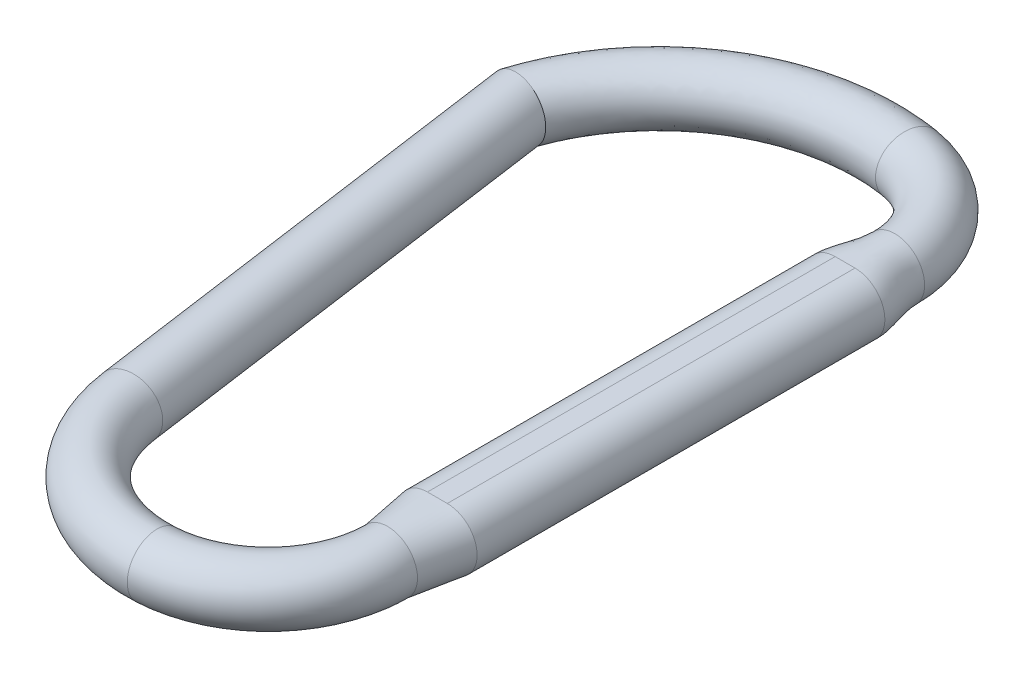
ISO-10303-21;
HEADER;
FILE_DESCRIPTION(('STEP AP214'),'2;1');
FILE_NAME('part.step','',(''),(''),'','','');
FILE_SCHEMA(('AUTOMOTIVE_DESIGN { 1 0 10303 214 1 1 1 1 }'));
ENDSEC;
DATA;
#1=APPLICATION_CONTEXT('core data for automotive mechanical design processes');
#2=APPLICATION_PROTOCOL_DEFINITION('international standard','automotive_design',2000,#1);
#3=PRODUCT_CONTEXT('',#1,'mechanical');
#4=PRODUCT('Part','Part','',(#3));
#5=PRODUCT_RELATED_PRODUCT_CATEGORY('part','',(#4));
#6=PRODUCT_DEFINITION_FORMATION('','',#4);
#7=PRODUCT_DEFINITION_CONTEXT('part definition',#1,'design');
#8=PRODUCT_DEFINITION('design','',#6,#7);
#9=PRODUCT_DEFINITION_SHAPE('','',#8);
#10=(LENGTH_UNIT() NAMED_UNIT(*) SI_UNIT(.MILLI.,.METRE.));
#11=(NAMED_UNIT(*) PLANE_ANGLE_UNIT() SI_UNIT($,.RADIAN.));
#12=(NAMED_UNIT(*) SI_UNIT($,.STERADIAN.) SOLID_ANGLE_UNIT());
#13=UNCERTAINTY_MEASURE_WITH_UNIT(LENGTH_MEASURE(1.E-05),#10,'distance_accuracy_value','');
#14=(GEOMETRIC_REPRESENTATION_CONTEXT(3) GLOBAL_UNCERTAINTY_ASSIGNED_CONTEXT((#13)) GLOBAL_UNIT_ASSIGNED_CONTEXT((#10,
#11,#12)) REPRESENTATION_CONTEXT('',''));
#15=CARTESIAN_POINT('',(0.,0.,0.));
#16=DIRECTION('',(0.,0.,1.));
#17=DIRECTION('',(1.,0.,0.));
#18=AXIS2_PLACEMENT_3D('',#15,#16,#17);
#19=CARTESIAN_POINT('',(-21.010039592114,0.,-46.87299947285));
#20=DIRECTION('',(0.13917310096006,0.,0.990268068741571));
#21=DIRECTION('',(0.990268068741571,0.,-0.13917310096006));
#22=AXIS2_PLACEMENT_3D('',#19,#20,#21);
#23=CYLINDRICAL_SURFACE('',#22,3.);
#24=CARTESIAN_POINT('',(-20.8896587934592,-3.,-46.0164455829451));
#25=CARTESIAN_POINT('',(-20.8951421724253,-3.00000001724637,-46.016930285687));
#26=CARTESIAN_POINT('',(-20.9006257203816,-2.99998563688095,-46.0174150031077));
#27=CARTESIAN_POINT('',(-20.9938981031441,-2.99949619718511,-46.025659797391));
#28=CARTESIAN_POINT('',(-21.0817077632023,-2.99534626632621,-46.0334216495132));
#29=CARTESIAN_POINT('',(-21.2566964226179,-2.9796888896988,-46.0488894914073));
#30=CARTESIAN_POINT('',(-21.3438750752085,-2.96817766929926,-46.0565954504677));
#31=CARTESIAN_POINT('',(-21.5171642397895,-2.93782561411557,-46.0719128522698));
#32=CARTESIAN_POINT('',(-21.6032720259248,-2.91896894098434,-46.079524053848));
#33=CARTESIAN_POINT('',(-21.7736483920337,-2.87403559519605,-46.0945838006386));
#34=CARTESIAN_POINT('',(-21.8579154186672,-2.84795306096237,-46.1020322084787));
#35=CARTESIAN_POINT('',(-22.1067312899974,-2.75917076926257,-46.1240250692375));
#36=CARTESIAN_POINT('',(-22.2676635406951,-2.68587157970876,-46.1382497418877));
#37=CARTESIAN_POINT('',(-22.5747456344284,-2.51281838387039,-46.1653923057207));
#38=CARTESIAN_POINT('',(-22.7208970469696,-2.41306719047859,-46.1783103356496));
#39=CARTESIAN_POINT('',(-22.9247206794201,-2.2464254273398,-46.1963258322359));
#40=CARTESIAN_POINT('',(-22.9897656410219,-2.18842172643041,-46.2020749936319));
#41=CARTESIAN_POINT('',(-23.1146072937272,-2.06706138885659,-46.2131094210775));
#42=CARTESIAN_POINT('',(-23.1744089255577,-2.00370990429972,-46.2183951238389));
#43=CARTESIAN_POINT('',(-23.2883520090666,-1.87202252243064,-46.228466234393));
#44=CARTESIAN_POINT('',(-23.3424912095336,-1.80368466087779,-46.2332514432046));
#45=CARTESIAN_POINT('',(-23.444640825475,-1.66254349678639,-46.242280152541));
#46=CARTESIAN_POINT('',(-23.4926499790285,-1.5897392793636,-46.2465235415278));
#47=CARTESIAN_POINT('',(-23.6245654839256,-1.36919677615312,-46.2581831690165));
#48=CARTESIAN_POINT('',(-23.6993805224947,-1.21582278118065,-46.2647958538162));
#49=CARTESIAN_POINT('',(-23.8215600497354,-0.898527407613988,-46.2755949560412));
#50=CARTESIAN_POINT('',(-23.8689291290896,-0.73460779800565,-46.2797817792223));
#51=CARTESIAN_POINT('',(-23.9339250396025,-0.404813782767175,-46.2855265919895));
#52=CARTESIAN_POINT('',(-23.9522077715259,-0.23906998094187,-46.287142554796));
#53=CARTESIAN_POINT('',(-23.9604729526079,0.0931160017219928,-46.2878730923304));
#54=CARTESIAN_POINT('',(-23.950457573906,0.259558127978508,-46.286987859048));
#55=CARTESIAN_POINT('',(-23.9027191387679,0.586626155300826,-46.2827683865265));
#56=CARTESIAN_POINT('',(-23.86528224346,0.747294280777364,-46.2794594402881));
#57=CARTESIAN_POINT('',(-23.764239320106,1.06010106739429,-46.2705285382299));
#58=CARTESIAN_POINT('',(-23.7006330009043,1.21223963361514,-46.2649065566757));
#59=CARTESIAN_POINT('',(-23.5487534644931,1.50481263920863,-46.2514823647213));
#60=CARTESIAN_POINT('',(-23.4603215948277,1.64516399679962,-46.2436661315348));
#61=CARTESIAN_POINT('',(-23.2616825698692,1.90934717733818,-46.2261089995393));
#62=CARTESIAN_POINT('',(-23.1514738150893,2.03317778573619,-46.2163679593554));
#63=CARTESIAN_POINT('',(-22.9069029753268,2.26655507987003,-46.1947509757078));
#64=CARTESIAN_POINT('',(-22.7716536430332,2.37516531676004,-46.1827966082223));
#65=CARTESIAN_POINT('',(-22.4848575764178,2.56811954472958,-46.1574472421762));
#66=CARTESIAN_POINT('',(-22.3333009081481,2.65244862816305,-46.1440513654903));
#67=CARTESIAN_POINT('',(-22.0183464771175,2.79470619940215,-46.1162127555998));
#68=CARTESIAN_POINT('',(-21.8549459739908,2.8526285546105,-46.1017697801227));
#69=CARTESIAN_POINT('',(-21.5211522594202,2.94059280071035,-46.0722654006039));
#70=CARTESIAN_POINT('',(-21.3507737453045,2.97069043164866,-46.0572052963479));
#71=CARTESIAN_POINT('',(-21.0884055316866,2.99502937517665,-46.0340136924453));
#72=CARTESIAN_POINT('',(-20.997256631083,2.99947891711674,-46.0259566739203));
#73=CARTESIAN_POINT('',(-20.9006258013465,2.99998561578759,-46.0174150102755));
#74=CARTESIAN_POINT('',(-20.8951422586448,2.99999999484322,-46.0169302933139));
#75=CARTESIAN_POINT('',(-20.8896587934592,3.,-46.0164455829451));
#76=B_SPLINE_CURVE_WITH_KNOTS('',3,(#24,#25,#26,#27,#28,#29,#30,#31,#32,#33,#34,#35,#36,#37,#38,
#39,#40,#41,#42,#43,#44,#45,#46,#47,#48,#49,#50,#51,#52,#53,#54,#55,#56,#57,#58,#59,#60,#61,#62,
#63,#64,#65,#66,#67,#68,#69,#70,#71,#72,#73,#74,#75),.UNSPECIFIED.,.F.,.F.,(4,2,2,2,2,2,2,2,2,2,
2,2,2,2,2,2,2,2,2,2,2,2,2,2,2,4),(0.,0.0165147571824949,0.28090350468109,0.545427930996735,
0.810525913435018,1.0758395746906,1.6053542719485,2.1348126834448,2.39656394511468,
2.65806584980441,2.91967132767677,3.18133057266935,3.69092805578215,4.2004402776712,
4.69829124615587,5.19610400105184,5.68879446502532,6.18149041072077,6.6774096522034,
7.17336533192341,7.69246926105735,8.21189122271954,8.73143375157408,9.24993323406481,
9.52444073575411,9.54095549293659),.UNSPECIFIED.);
#77=CARTESIAN_POINT('',(-20.8896587934592,-3.,-46.0164455829451));
#78=VERTEX_POINT('',#77);
#79=CARTESIAN_POINT('',(-20.8896587934592,3.,-46.0164455829451));
#80=VERTEX_POINT('',#79);
#81=EDGE_CURVE('E314',#78,#80,#76,.T.);
#82=ORIENTED_EDGE('',*,*,#81,.F.);
#83=CARTESIAN_POINT('',(-20.8896587934592,-3.,-46.0164455829451));
#84=CARTESIAN_POINT('',(-20.8841754144568,-3.00000001726389,-46.0159608806029));
#85=CARTESIAN_POINT('',(-20.8786918870788,-2.99998563690161,-46.0154759307387));
#86=CARTESIAN_POINT('',(-20.7852165904912,-2.99949514284939,-46.0072052123919));
#87=CARTESIAN_POINT('',(-20.6972091543279,-2.99532723552518,-45.999358026544));
#88=CARTESIAN_POINT('',(-20.5218388202666,-2.97960711417015,-45.9836029130286));
#89=CARTESIAN_POINT('',(-20.4344762792888,-2.96805108185668,-45.9756949560429));
#90=CARTESIAN_POINT('',(-20.2608332379902,-2.93758913412737,-45.9598607263474));
#91=CARTESIAN_POINT('',(-20.1745555161273,-2.918667228798,-45.9519344513401));
#92=CARTESIAN_POINT('',(-20.0038549280286,-2.87358927225436,-45.9361383356767));
#93=CARTESIAN_POINT('',(-19.9194336208397,-2.84742737377111,-45.9282685459332));
#94=CARTESIAN_POINT('',(-19.6701937823624,-2.7584001620235,-45.9048669109586));
#95=CARTESIAN_POINT('',(-19.5090120188892,-2.68492514613336,-45.8895074304168));
#96=CARTESIAN_POINT('',(-19.2014624905548,-2.51151000997371,-45.8598011399984));
#97=CARTESIAN_POINT('',(-19.05509324771,-2.4115725337172,-45.8454542291314));
#98=CARTESIAN_POINT('',(-18.8508519581832,-2.24454824457002,-45.8251885801709));
#99=CARTESIAN_POINT('',(-18.7856079381955,-2.18634841088113,-45.8186715463453));
#100=CARTESIAN_POINT('',(-18.660391023001,-2.06457020204743,-45.8060912871512));
#101=CARTESIAN_POINT('',(-18.6004131681056,-2.00099700077651,-45.8000276356028));
#102=CARTESIAN_POINT('',(-18.4861453305037,-1.86883876362132,-45.7884138206629));
#103=CARTESIAN_POINT('',(-18.4318575895841,-1.80025177033644,-45.7828638597547));
#104=CARTESIAN_POINT('',(-18.3294456912057,-1.65858405899606,-45.772344346583));
#105=CARTESIAN_POINT('',(-18.281322792024,-1.58550242805197,-45.7673749128263));
#106=CARTESIAN_POINT('',(-18.1492590452969,-1.36430645569479,-45.7536816479021));
#107=CARTESIAN_POINT('',(-18.0744341895986,-1.21053734066333,-45.7458466150474));
#108=CARTESIAN_POINT('',(-17.9523935953468,-0.892399581644719,-45.7330080848875));
#109=CARTESIAN_POINT('',(-17.9051724169469,-0.72803303318346,-45.7280040296889));
#110=CARTESIAN_POINT('',(-17.8408048652615,-0.398028715403323,-45.7211710336458));
#111=CARTESIAN_POINT('',(-17.822883547413,-0.232544116681888,-45.7192602924425));
#112=CARTESIAN_POINT('',(-17.8153214622296,0.0990697030326118,-45.7184548434859));
#113=CARTESIAN_POINT('',(-17.82567800624,0.265198861241316,-45.7195598489958));
#114=CARTESIAN_POINT('',(-17.8739771570599,0.591161460422553,-45.7246943629733));
#115=CARTESIAN_POINT('',(-17.9115686653581,0.751047993650433,-45.7286866490242));
#116=CARTESIAN_POINT('',(-18.0127556319482,1.06235574995448,-45.7393666964543));
#117=CARTESIAN_POINT('',(-18.0763519673559,1.21377668729906,-45.7460545487522));
#118=CARTESIAN_POINT('',(-18.1899123485645,1.43192600516249,-45.75789431535));
#119=CARTESIAN_POINT('',(-18.2310235120433,1.50345125061217,-45.7621659544882));
#120=CARTESIAN_POINT('',(-18.3189931109808,1.64284156808303,-45.7712644762543));
#121=CARTESIAN_POINT('',(-18.3658503716853,1.71070738418097,-45.7760912453769));
#122=CARTESIAN_POINT('',(-18.4649426073333,1.84231372795867,-45.7862466985763));
#123=CARTESIAN_POINT('',(-18.5171757684058,1.90605563533231,-45.7915752133091));
#124=CARTESIAN_POINT('',(-18.6266758244383,2.02908952130601,-45.8026839570851));
#125=CARTESIAN_POINT('',(-18.6839470667635,2.08837757325301,-45.8084645757627));
#126=CARTESIAN_POINT('',(-18.8654838166437,2.26162084209706,-45.826678663273));
#127=CARTESIAN_POINT('',(-18.9971705592696,2.36789859643496,-45.8397470274584));
#128=CARTESIAN_POINT('',(-19.2760879381005,2.55741589632404,-45.8670491001033));
#129=CARTESIAN_POINT('',(-19.4233215998858,2.64065094608572,-45.8812830352726));
#130=CARTESIAN_POINT('',(-19.6548629552924,2.74778335144924,-45.9033554048232));
#131=CARTESIAN_POINT('',(-19.735056226172,2.78088039577154,-45.9109474352307));
#132=CARTESIAN_POINT('',(-19.8978550590291,2.8402592868587,-45.9262499892075));
#133=CARTESIAN_POINT('',(-19.9804584207828,2.8665471458607,-45.9339604018331));
#134=CARTESIAN_POINT('',(-20.1474349423873,2.91214117251307,-45.9494342800216));
#135=CARTESIAN_POINT('',(-20.2318054247945,2.9314571934694,-45.9571976547855));
#136=CARTESIAN_POINT('',(-20.4018419871953,2.96304638286254,-45.9727302229829));
#137=CARTESIAN_POINT('',(-20.487508029451,2.97531975603819,-45.9804994162408));
#138=CARTESIAN_POINT('',(-20.6731099932719,2.99411498837592,-45.9972080574238));
#139=CARTESIAN_POINT('',(-20.7731753829563,2.9994318502992,-46.0061398007653));
#140=CARTESIAN_POINT('',(-20.8786919243768,2.99998564304928,-46.0154759341691));
#141=CARTESIAN_POINT('',(-20.8841754525497,3.00000002361417,-46.0159608841108));
#142=CARTESIAN_POINT('',(-20.8896587934592,3.,-46.0164455829451));
#143=B_SPLINE_CURVE_WITH_KNOTS('',3,(#83,#84,#85,#86,#87,#88,#89,#90,#91,#92,#93,#94,#95,#96,
#97,#98,#99,#100,#101,#102,#103,#104,#105,#106,#107,#108,#109,#110,#111,#112,#113,#114,#115,
#116,#117,#118,#119,#120,#121,#122,#123,#124,#125,#126,#127,#128,#129,#130,#131,#132,#133,#134,
#135,#136,#137,#138,#139,#140,#141,#142),.UNSPECIFIED.,.F.,.F.,(4,2,2,2,2,2,2,2,2,2,2,2,2,2,2,2,
2,2,2,2,2,2,2,2,2,2,2,2,2,4),(0.,0.0165147571950974,0.281516718087598,0.546655746401362,
0.81237358007404,1.07830664613123,1.60900330966092,2.13964696830225,2.40239346052579,
2.66488978191802,2.92748913572783,3.19014200235839,3.70094942104827,4.21165614114543,
4.70862295814746,5.20554252526409,5.69616753876884,6.18680910190998,6.43440241349732,
6.68194519027568,6.92940471630417,7.17707991022057,7.68379232741825,8.19060353811543,
8.45160827165583,8.71238175681237,8.97278523391203,9.23318114036325,9.53444519200026,
9.55095994919536),.UNSPECIFIED.);
#144=EDGE_CURVE('E317',#78,#80,#143,.T.);
#145=ORIENTED_EDGE('',*,*,#144,.T.);
#146=EDGE_LOOP('',(#82,#145));
#147=FACE_BOUND('',#146,.T.);
#148=CARTESIAN_POINT('',(-14.4897268873601,0.,-0.478563872965583));
#149=DIRECTION('',(0.139173100960063,0.,0.990268068741571));
#150=DIRECTION('',(0.990268068741571,0.,-0.139173100960063));
#151=AXIS2_PLACEMENT_3D('',#148,#149,#150);
#152=CIRCLE('',#151,3.);
#153=CARTESIAN_POINT('',(-17.4605310935849,0.,-0.0610445700853991));
#154=VERTEX_POINT('',#153);
#155=EDGE_CURVE('E307',#154,#154,#152,.T.);
#156=ORIENTED_EDGE('',*,*,#155,.F.);
#157=EDGE_LOOP('',(#156));
#158=FACE_BOUND('',#157,.T.);
#159=ADVANCED_FACE('F296',(#147,#158),#23,.T.);
#160=CARTESIAN_POINT('',(-0.130839890607351,0.,-2.49657383688644));
#161=DIRECTION('',(0.,1.,0.));
#162=DIRECTION('',(0.,0.,1.));
#163=AXIS2_PLACEMENT_3D('',#160,#161,#162);
#164=TOROIDAL_SURFACE('',#163,14.5000000000001,3.);
#165=CARTESIAN_POINT('',(0.628031474915289,0.,11.9835544170549));
#166=DIRECTION('',(0.998629534754574,0.,-0.0523359562429437));
#167=DIRECTION('',(-0.0523359562429437,0.,-0.998629534754574));
#168=AXIS2_PLACEMENT_3D('',#165,#166,#167);
#169=CIRCLE('',#168,3.);
#170=CARTESIAN_POINT('',(0.785039343644113,0.,14.9794430213187));
#171=VERTEX_POINT('',#170);
#172=EDGE_CURVE('E15',#171,#171,#169,.T.);
#173=CARTESIAN_POINT('',(-0.130839890607351,0.,-2.49657383688644));
#174=DIRECTION('',(0.,1.,0.));
#175=DIRECTION('',(0.,0.,1.));
#176=AXIS2_PLACEMENT_3D('',#173,#174,#175);
#177=CIRCLE('',#176,17.5000000000001);
#178=EDGE_CURVE('',#154,#171,#177,.T.);
#179=ORIENTED_EDGE('',*,*,#155,.T.);
#180=ORIENTED_EDGE('',*,*,#172,.F.);
#181=ORIENTED_EDGE('',*,*,#178,.T.);
#182=ORIENTED_EDGE('',*,*,#178,.F.);
#183=EDGE_LOOP('',(#179,#181,#180,#182));
#184=FACE_BOUND('',#183,.T.);
#185=ADVANCED_FACE('F623',(#184),#164,.T.);
#186=CARTESIAN_POINT('',(0.,0.,0.));
#187=DIRECTION('',(0.,1.,0.));
#188=DIRECTION('',(0.,0.,1.));
#189=AXIS2_PLACEMENT_3D('',#186,#187,#188);
#190=TOROIDAL_SURFACE('',#189,12.,3.);
#191=ORIENTED_EDGE('',*,*,#172,.T.);
#192=EDGE_LOOP('',(#191));
#193=FACE_BOUND('',#192,.T.);
#194=CARTESIAN_POINT('',(12.,0.,0.));
#195=DIRECTION('',(0.,0.,1.));
#196=DIRECTION('',(1.,0.,0.));
#197=AXIS2_PLACEMENT_3D('',#194,#195,#196);
#198=CIRCLE('',#197,3.);
#199=CARTESIAN_POINT('',(15.,0.,0.));
#200=VERTEX_POINT('',#199);
#201=EDGE_CURVE('E570',#200,#200,#198,.F.);
#202=ORIENTED_EDGE('',*,*,#201,.F.);
#203=EDGE_LOOP('',(#202));
#204=FACE_BOUND('',#203,.T.);
#205=ADVANCED_FACE('F298',(#193,#204),#190,.T.);
#206=CARTESIAN_POINT('',(3.15418270687267,0.,-57.9206372285439));
#207=CARTESIAN_POINT('',(0.935857684764375,0.,-58.2914775108197));
#208=CARTESIAN_POINT('',(-1.34841307466067,0.,-58.2642441530716));
#209=CARTESIAN_POINT('',(-5.76611963223035,0.,-57.4170009365223));
#210=CARTESIAN_POINT('',(-7.8983918081825,0.,-56.597214214087));
#211=CARTESIAN_POINT('',(-11.7458601181143,0.,-54.2667765083098));
#212=CARTESIAN_POINT('',(-13.4600429064005,0.,-52.7567393086641));
#213=CARTESIAN_POINT('',(-15.5578651785087,0.,-50.1146303562383));
#214=CARTESIAN_POINT('',(-16.1786796426522,0.,-49.1717851595225));
#215=CARTESIAN_POINT('',(-16.9777715733016,0.,-47.6862329237682));
#216=CARTESIAN_POINT('',(-17.2221421093404,0.,-47.1792123400172));
#217=CARTESIAN_POINT('',(-17.5542607274369,0.,-46.4039255360115));
#218=CARTESIAN_POINT('',(-17.6592304308953,0.,-46.1430382759708));
#219=CARTESIAN_POINT('',(-17.8574929369031,0.,-45.616851470807));
#220=CARTESIAN_POINT('',(-17.9438855104909,0.,-45.3726502068817));
#221=CARTESIAN_POINT('',(-18.1216320372242,0.,-44.8289305195341));
#222=CARTESIAN_POINT('',(-18.2173244687306,0.,-44.5361915610607));
#223=CARTESIAN_POINT('',(-18.3069113882336,0.,-44.2621388982983));
#224=CARTESIAN_POINT('',(3.15418270687267,6.,-57.9206372285439));
#225=CARTESIAN_POINT('',(0.935857684764375,6.,-58.2914775108197));
#226=CARTESIAN_POINT('',(-1.34841307466067,6.,-58.2642441530716));
#227=CARTESIAN_POINT('',(-5.76611963223035,6.,-57.4170009365223));
#228=CARTESIAN_POINT('',(-7.8983918081825,6.,-56.597214214087));
#229=CARTESIAN_POINT('',(-11.7458601181143,6.,-54.2667765083098));
#230=CARTESIAN_POINT('',(-13.4600429064005,6.,-52.7567393086641));
#231=CARTESIAN_POINT('',(-15.5578651785087,6.,-50.1146303562383));
#232=CARTESIAN_POINT('',(-16.1786796426522,6.,-49.1717851595225));
#233=CARTESIAN_POINT('',(-16.9777715733016,6.,-47.6862329237682));
#234=CARTESIAN_POINT('',(-17.2221421093404,6.,-47.1792123400172));
#235=CARTESIAN_POINT('',(-17.5542607274369,6.,-46.4039255360115));
#236=CARTESIAN_POINT('',(-17.6592304308953,6.,-46.1430382759708));
#237=CARTESIAN_POINT('',(-17.8574929369031,6.,-45.616851470807));
#238=CARTESIAN_POINT('',(-17.9438855104909,6.,-45.3726502068817));
#239=CARTESIAN_POINT('',(-18.1216320372242,6.,-44.8289305195341));
#240=CARTESIAN_POINT('',(-18.2173244687306,6.,-44.5361915610607));
#241=CARTESIAN_POINT('',(-18.3069113882336,6.,-44.2621388982983));
#242=CARTESIAN_POINT('',(4.14348216990634,6.,-63.8385157819143));
#243=CARTESIAN_POINT('',(1.22463345660595,6.,-64.3264635217509));
#244=CARTESIAN_POINT('',(-1.78098596370917,6.,-64.2906301562933));
#245=CARTESIAN_POINT('',(-7.59375774994703,6.,-63.1758364503064));
#246=CARTESIAN_POINT('',(-10.399379034115,6.,-62.0971697102661));
#247=CARTESIAN_POINT('',(-15.4618373366541,6.,-59.0308043079163));
#248=CARTESIAN_POINT('',(-17.7173410054562,6.,-57.0439132557572));
#249=CARTESIAN_POINT('',(-20.4776334687519,6.,-53.5674541078277));
#250=CARTESIAN_POINT('',(-21.2944946057871,6.,-52.3268683226758));
#251=CARTESIAN_POINT('',(-22.3459313566373,6.,-50.3721943282618));
#252=CARTESIAN_POINT('',(-22.6674715356357,6.,-49.705061981224));
#253=CARTESIAN_POINT('',(-23.1044697173438,6.,-48.6849477654229));
#254=CARTESIAN_POINT('',(-23.2425877482096,6.,-48.3416750548433));
#255=CARTESIAN_POINT('',(-23.5034594666404,6.,-47.6493239954194));
#256=CARTESIAN_POINT('',(-23.6331064283333,6.,-47.2791454768079));
#257=CARTESIAN_POINT('',(-23.8368656113514,6.,-46.6558573747056));
#258=CARTESIAN_POINT('',(-23.9203407962011,6.,-46.4004889538082));
#259=CARTESIAN_POINT('',(-24.0099277157041,6.,-46.1264362910458));
#260=CARTESIAN_POINT('',(4.14348216990634,0.,-63.8385157819143));
#261=CARTESIAN_POINT('',(1.22463345660595,0.,-64.3264635217509));
#262=CARTESIAN_POINT('',(-1.78098596370917,0.,-64.2906301562933));
#263=CARTESIAN_POINT('',(-7.59375774994703,0.,-63.1758364503064));
#264=CARTESIAN_POINT('',(-10.399379034115,0.,-62.0971697102661));
#265=CARTESIAN_POINT('',(-15.4618373366541,0.,-59.0308043079163));
#266=CARTESIAN_POINT('',(-17.7173410054562,0.,-57.0439132557571));
#267=CARTESIAN_POINT('',(-20.4776334687519,0.,-53.5674541078277));
#268=CARTESIAN_POINT('',(-21.2944946057871,0.,-52.3268683226758));
#269=CARTESIAN_POINT('',(-22.3459313566373,0.,-50.3721943282618));
#270=CARTESIAN_POINT('',(-22.6674715356357,0.,-49.705061981224));
#271=CARTESIAN_POINT('',(-23.1044697173438,0.,-48.6849477654229));
#272=CARTESIAN_POINT('',(-23.2425877482096,0.,-48.3416750548433));
#273=CARTESIAN_POINT('',(-23.5034594666404,0.,-47.6493239954194));
#274=CARTESIAN_POINT('',(-23.6331064283333,0.,-47.2791454768079));
#275=CARTESIAN_POINT('',(-23.8368656113514,0.,-46.6558573747056));
#276=CARTESIAN_POINT('',(-23.9203407962011,0.,-46.4004889538082));
#277=CARTESIAN_POINT('',(-24.0099277157041,0.,-46.1264362910458));
#278=CARTESIAN_POINT('',(4.14348216990634,-6.,-63.8385157819143));
#279=CARTESIAN_POINT('',(1.22463345660595,-6.,-64.3264635217509));
#280=CARTESIAN_POINT('',(-1.78098596370917,-6.,-64.2906301562933));
#281=CARTESIAN_POINT('',(-7.59375774994703,-6.,-63.1758364503064));
#282=CARTESIAN_POINT('',(-10.399379034115,-6.,-62.0971697102661));
#283=CARTESIAN_POINT('',(-15.4618373366541,-6.,-59.0308043079163));
#284=CARTESIAN_POINT('',(-17.7173410054562,-6.,-57.0439132557572));
#285=CARTESIAN_POINT('',(-20.4776334687519,-6.,-53.5674541078277));
#286=CARTESIAN_POINT('',(-21.2944946057871,-6.,-52.3268683226758));
#287=CARTESIAN_POINT('',(-22.3459313566373,-6.,-50.3721943282618));
#288=CARTESIAN_POINT('',(-22.6674715356357,-6.,-49.705061981224));
#289=CARTESIAN_POINT('',(-23.1044697173438,-6.,-48.6849477654229));
#290=CARTESIAN_POINT('',(-23.2425877482096,-6.,-48.3416750548433));
#291=CARTESIAN_POINT('',(-23.5034594666404,-6.,-47.6493239954194));
#292=CARTESIAN_POINT('',(-23.6331064283333,-6.,-47.2791454768079));
#293=CARTESIAN_POINT('',(-23.8368656113514,-6.,-46.6558573747056));
#294=CARTESIAN_POINT('',(-23.9203407962011,-6.,-46.4004889538082));
#295=CARTESIAN_POINT('',(-24.0099277157041,-6.,-46.1264362910458));
#296=CARTESIAN_POINT('',(3.15418270687267,-6.,-57.9206372285439));
#297=CARTESIAN_POINT('',(0.935857684764375,-6.,-58.2914775108197));
#298=CARTESIAN_POINT('',(-1.34841307466067,-6.,-58.2642441530716));
#299=CARTESIAN_POINT('',(-5.76611963223035,-6.,-57.4170009365223));
#300=CARTESIAN_POINT('',(-7.8983918081825,-6.,-56.597214214087));
#301=CARTESIAN_POINT('',(-11.7458601181143,-6.,-54.2667765083098));
#302=CARTESIAN_POINT('',(-13.4600429064005,-6.,-52.7567393086641));
#303=CARTESIAN_POINT('',(-15.5578651785087,-6.,-50.1146303562383));
#304=CARTESIAN_POINT('',(-16.1786796426522,-6.,-49.1717851595225));
#305=CARTESIAN_POINT('',(-16.9777715733016,-6.,-47.6862329237682));
#306=CARTESIAN_POINT('',(-17.2221421093404,-6.,-47.1792123400172));
#307=CARTESIAN_POINT('',(-17.5542607274369,-6.,-46.4039255360115));
#308=CARTESIAN_POINT('',(-17.6592304308953,-6.,-46.1430382759708));
#309=CARTESIAN_POINT('',(-17.8574929369031,-6.,-45.616851470807));
#310=CARTESIAN_POINT('',(-17.9438855104909,-6.,-45.3726502068817));
#311=CARTESIAN_POINT('',(-18.1216320372242,-6.,-44.8289305195341));
#312=CARTESIAN_POINT('',(-18.2173244687306,-6.,-44.5361915610607));
#313=CARTESIAN_POINT('',(-18.3069113882336,-6.,-44.2621388982983));
#314=CARTESIAN_POINT('',(3.15418270687267,0.,-57.9206372285439));
#315=CARTESIAN_POINT('',(0.935857684764375,0.,-58.2914775108197));
#316=CARTESIAN_POINT('',(-1.34841307466067,0.,-58.2642441530716));
#317=CARTESIAN_POINT('',(-5.76611963223035,0.,-57.4170009365223));
#318=CARTESIAN_POINT('',(-7.8983918081825,0.,-56.597214214087));
#319=CARTESIAN_POINT('',(-11.7458601181143,0.,-54.2667765083098));
#320=CARTESIAN_POINT('',(-13.4600429064005,0.,-52.7567393086641));
#321=CARTESIAN_POINT('',(-15.5578651785087,0.,-50.1146303562383));
#322=CARTESIAN_POINT('',(-16.1786796426522,0.,-49.1717851595225));
#323=CARTESIAN_POINT('',(-16.9777715733016,0.,-47.6862329237682));
#324=CARTESIAN_POINT('',(-17.2221421093404,0.,-47.1792123400172));
#325=CARTESIAN_POINT('',(-17.5542607274369,0.,-46.4039255360115));
#326=CARTESIAN_POINT('',(-17.6592304308953,0.,-46.1430382759708));
#327=CARTESIAN_POINT('',(-17.8574929369031,0.,-45.616851470807));
#328=CARTESIAN_POINT('',(-17.9438855104909,0.,-45.3726502068817));
#329=CARTESIAN_POINT('',(-18.1216320372242,0.,-44.8289305195341));
#330=CARTESIAN_POINT('',(-18.2173244687306,0.,-44.5361915610607));
#331=CARTESIAN_POINT('',(-18.3069113882336,0.,-44.2621388982983));
#332=(BOUNDED_SURFACE() B_SPLINE_SURFACE(3,3,((#206,#207,#208,#209,#210,#211,#212,#213,#214,
#215,#216,#217,#218,#219,#220,#221,#222,#223),(#224,#225,#226,#227,#228,#229,#230,#231,#232,
#233,#234,#235,#236,#237,#238,#239,#240,#241),(#242,#243,#244,#245,#246,#247,#248,#249,#250,
#251,#252,#253,#254,#255,#256,#257,#258,#259),(#260,#261,#262,#263,#264,#265,#266,#267,#268,
#269,#270,#271,#272,#273,#274,#275,#276,#277),(#278,#279,#280,#281,#282,#283,#284,#285,#286,
#287,#288,#289,#290,#291,#292,#293,#294,#295),(#296,#297,#298,#299,#300,#301,#302,#303,#304,
#305,#306,#307,#308,#309,#310,#311,#312,#313),(#314,#315,#316,#317,#318,#319,#320,#321,#322,
#323,#324,#325,#326,#327,#328,#329,#330,#331)),.UNSPECIFIED.,.T.,.F.,
.F.) B_SPLINE_SURFACE_WITH_KNOTS((4,3,4),(4,2,2,2,2,2,2,2,4),(0.,0.5,1.),(0.828327012053522,
0.871245259040141,0.914163506026761,0.95708175301338,0.97854087650669,0.989270438253345,
0.994635219126673,1.,1.00475106234289),
.UNSPECIFIED.) GEOMETRIC_REPRESENTATION_ITEM() RATIONAL_B_SPLINE_SURFACE(((1.,1.,1.,1.,1.,1.,1.,
1.,1.,1.,1.,1.,1.,1.,1.,1.,1.,1.),(0.333333333333333,0.333333333333333,0.333333333333333,
0.333333333333333,0.333333333333333,0.333333333333333,0.333333333333333,0.333333333333333,
0.333333333333333,0.333333333333333,0.333333333333333,0.333333333333333,0.333333333333333,
0.333333333333333,0.333333333333333,0.333333333333333,0.333333333333333,0.333333333333333),
(0.333333333333333,0.333333333333333,0.333333333333333,0.333333333333333,0.333333333333333,
0.333333333333333,0.333333333333333,0.333333333333333,0.333333333333333,0.333333333333333,
0.333333333333333,0.333333333333333,0.333333333333333,0.333333333333333,0.333333333333333,
0.333333333333333,0.333333333333333,0.333333333333333),(1.,1.,1.,1.,1.,1.,1.,1.,1.,1.,1.,1.,1.,
1.,1.,1.,1.,1.),(0.333333333333333,0.333333333333333,0.333333333333333,0.333333333333333,
0.333333333333333,0.333333333333333,0.333333333333333,0.333333333333333,0.333333333333333,
0.333333333333333,0.333333333333333,0.333333333333333,0.333333333333333,0.333333333333333,
0.333333333333333,0.333333333333333,0.333333333333333,0.333333333333333),(0.333333333333333,
0.333333333333333,0.333333333333333,0.333333333333333,0.333333333333333,0.333333333333333,
0.333333333333333,0.333333333333333,0.333333333333333,0.333333333333333,0.333333333333333,
0.333333333333333,0.333333333333333,0.333333333333333,0.333333333333333,0.333333333333333,
0.333333333333333,0.333333333333333),(1.,1.,1.,1.,1.,1.,1.,1.,1.,1.,1.,1.,1.,1.,1.,1.,1.,1.))) REPRESENTATION_ITEM('') SURFACE());
#333=CARTESIAN_POINT('',(3.6488324383895,0.,-60.8795765052291));
#334=DIRECTION('',(-0.986313092228399,0.,-0.164883243838946));
#335=DIRECTION('',(-0.164883243838946,0.,0.986313092228399));
#336=AXIS2_PLACEMENT_3D('',#333,#334,#335);
#337=CIRCLE('',#336,3.);
#338=CARTESIAN_POINT('',(3.15418270687267,0.,-57.9206372285439));
#339=VERTEX_POINT('',#338);
#340=EDGE_CURVE('E600',#339,#339,#337,.T.);
#341=ORIENTED_EDGE('',*,*,#144,.F.);
#342=ORIENTED_EDGE('',*,*,#81,.T.);
#343=EDGE_LOOP('',(#341,#342));
#344=FACE_BOUND('',#343,.T.);
#345=ORIENTED_EDGE('',*,*,#340,.T.);
#346=EDGE_LOOP('',(#345));
#347=FACE_BOUND('',#346,.T.);
#348=ADVANCED_FACE('F615',(#344,#347),#332,.T.);
#349=CARTESIAN_POINT('',(2.,0.,-51.0164455829451));
#350=DIRECTION('',(0.,1.,0.));
#351=DIRECTION('',(0.,0.,1.));
#352=AXIS2_PLACEMENT_3D('',#349,#350,#351);
#353=TOROIDAL_SURFACE('',#352,10.,3.);
#354=ORIENTED_EDGE('',*,*,#340,.F.);
#355=EDGE_LOOP('',(#354));
#356=FACE_BOUND('',#355,.T.);
#357=CARTESIAN_POINT('',(12.,0.,-51.0164455829451));
#358=DIRECTION('',(0.,0.,-1.));
#359=DIRECTION('',(-1.,0.,0.));
#360=AXIS2_PLACEMENT_3D('',#357,#358,#359);
#361=CIRCLE('',#360,3.);
#362=CARTESIAN_POINT('',(9.00000000000001,0.,-51.0164455829451));
#363=VERTEX_POINT('',#362);
#364=EDGE_CURVE('E435',#363,#363,#361,.F.);
#365=ORIENTED_EDGE('',*,*,#364,.F.);
#366=EDGE_LOOP('',(#365));
#367=FACE_BOUND('',#366,.T.);
#368=ADVANCED_FACE('F652',(#356,#367),#353,.T.);
#369=CARTESIAN_POINT('',(11.0000000009824,-3.,-4.99999999999999));
#370=CARTESIAN_POINT('',(11.0513167018657,-2.84604989412361,0.));
#371=CARTESIAN_POINT('',(11.1808403689908,-3.,-4.99999999999999));
#372=CARTESIAN_POINT('',(11.1928439280176,-2.89322563617423,0.));
#373=CARTESIAN_POINT('',(11.5188024091045,-3.,-4.99999999999999));
#374=CARTESIAN_POINT('',(11.4978250295683,-2.97124539024449,0.));
#375=CARTESIAN_POINT('',(12.,-3.,-4.99999999999999));
#376=CARTESIAN_POINT('',(11.9999606894242,-3.01445116747624,0.));
#377=CARTESIAN_POINT('',(12.4811975908955,-3.,-4.99999999999999));
#378=CARTESIAN_POINT('',(12.5021495793766,-2.9712604994524,0.));
#379=CARTESIAN_POINT('',(12.8191596310092,-3.,-4.99999999999999));
#380=CARTESIAN_POINT('',(12.8071560719824,-2.89322563617423,0.));
#381=CARTESIAN_POINT('',(13.3856122274595,-3.,-4.99999999999999));
#382=CARTESIAN_POINT('',(13.2504667420781,-2.74545541280903,0.));
#383=CARTESIAN_POINT('',(14.1622158476823,-2.84944772848077,-5.));
#384=CARTESIAN_POINT('',(13.8160051146318,-2.44769746646658,0.));
#385=CARTESIAN_POINT('',(15.1640551688845,-2.18972405819259,-4.99999999999999));
#386=CARTESIAN_POINT('',(14.4831666352821,-1.77205378628339,0.));
#387=CARTESIAN_POINT('',(15.8407543213467,-1.18888402148369,-5.));
#388=CARTESIAN_POINT('',(14.902121626076,-0.928103535733398,0.));
#389=CARTESIAN_POINT('',(16.0798036249834,0.,-4.99999999999998));
#390=CARTESIAN_POINT('',(15.0495474890088,0.,0.));
#391=CARTESIAN_POINT('',(15.8407543213467,1.1888840214837,-5.));
#392=CARTESIAN_POINT('',(14.902121626076,0.928103535733398,0.));
#393=CARTESIAN_POINT('',(15.1640551688844,2.18972405819259,-4.99999999999999));
#394=CARTESIAN_POINT('',(14.4831666352821,1.77205378628339,0.));
#395=CARTESIAN_POINT('',(14.1622158476823,2.84944772848078,-5.));
#396=CARTESIAN_POINT('',(13.8160051146318,2.44769746646658,0.));
#397=CARTESIAN_POINT('',(13.3856122274595,3.,-4.99999999999999));
#398=CARTESIAN_POINT('',(13.2504667420781,2.74545541280903,0.));
#399=CARTESIAN_POINT('',(12.8191596310092,3.,-4.99999999999999));
#400=CARTESIAN_POINT('',(12.8071560719824,2.89322563617423,0.));
#401=CARTESIAN_POINT('',(12.4811975908955,3.,-5.));
#402=CARTESIAN_POINT('',(12.5021749704317,2.97124539024449,0.));
#403=CARTESIAN_POINT('',(12.,3.,-4.99999999999999));
#404=CARTESIAN_POINT('',(12.0000393105758,3.01445116747624,0.));
#405=CARTESIAN_POINT('',(11.5188024091045,3.,-5.));
#406=CARTESIAN_POINT('',(11.4978504206234,2.9712604994524,0.));
#407=CARTESIAN_POINT('',(11.1808403689908,3.,-4.99999999999999));
#408=CARTESIAN_POINT('',(11.1928439280176,2.89322563617423,0.));
#409=CARTESIAN_POINT('',(10.6143877725405,3.,-4.99999999999999));
#410=CARTESIAN_POINT('',(10.7495332579219,2.74545541280903,0.));
#411=CARTESIAN_POINT('',(9.83778415231774,2.84944772848077,-4.99999999999999));
#412=CARTESIAN_POINT('',(10.1839948853682,2.44769746646658,0.));
#413=CARTESIAN_POINT('',(8.83594483111558,2.18972405819258,-4.99999999999999));
#414=CARTESIAN_POINT('',(9.51683336471787,1.77205378628339,0.));
#415=CARTESIAN_POINT('',(8.15924567865329,1.1888840214837,-5.));
#416=CARTESIAN_POINT('',(9.09787837392405,0.928103535733398,0.));
#417=CARTESIAN_POINT('',(7.92019637501657,0.,-4.99999999999998));
#418=CARTESIAN_POINT('',(8.95045251099126,0.,0.));
#419=CARTESIAN_POINT('',(8.1592456786533,-1.1888840214837,-5.));
#420=CARTESIAN_POINT('',(9.09787837392405,-0.928103535733399,0.));
#421=CARTESIAN_POINT('',(8.83594483111557,-2.18972405819259,-4.99999999999999));
#422=CARTESIAN_POINT('',(9.51683336471787,-1.77205378628339,0.));
#423=CARTESIAN_POINT('',(9.83778415231776,-2.84944772848078,-4.99999999999999));
#424=CARTESIAN_POINT('',(10.1839948853682,-2.44769746646658,0.));
#425=CARTESIAN_POINT('',(10.6143877725405,-3.,-4.99999999999999));
#426=CARTESIAN_POINT('',(10.7495332579219,-2.74545541280903,0.));
#427=CARTESIAN_POINT('',(11.0000000009824,-3.,-4.99999999999999));
#428=CARTESIAN_POINT('',(11.0513167018657,-2.84604989412361,0.));
#429=B_SPLINE_SURFACE_WITH_KNOTS('',3,1,((#369,#370),(#371,#372),(#373,#374),(#375,#376),(#377,
#378),(#379,#380),(#381,#382),(#383,#384),(#385,#386),(#387,#388),(#389,#390),(#391,#392),(#393,
#394),(#395,#396),(#397,#398),(#399,#400),(#401,#402),(#403,#404),(#405,#406),(#407,#408),(#409,
#410),(#411,#412),(#413,#414),(#415,#416),(#417,#418),(#419,#420),(#421,#422),(#423,#424),(#425,
#426),(#427,#428)),.UNSPECIFIED.,.T.,.F.,.F.,(4,1,1,1,2,1,1,1,1,1,1,1,2,1,1,1,2,1,1,1,1,1,1,1,
4),(2,2),(0.,0.0237431794663832,0.0474863589327664,0.0712295383991497,0.0949727178655329,
0.145601128132341,0.19622953839915,0.246857948665958,0.297486358932766,0.348114769199575,
0.398743179466383,0.449371589733191,0.5,0.523743179466383,0.547486358932766,0.57122953839915,
0.594972717865533,0.645601128132341,0.69622953839915,0.746857948665958,0.797486358932766,
0.848114769199575,0.898743179466383,0.949371589733192,1.),(0.,1.),.UNSPECIFIED.);
#430=CARTESIAN_POINT('',(13.,0.,-4.99999999999999));
#431=DIRECTION('',(0.,0.,-1.));
#432=DIRECTION('',(-1.,0.,0.));
#433=AXIS2_PLACEMENT_3D('',#430,#431,#432);
#434=CIRCLE('',#433,3.);
#435=CARTESIAN_POINT('',(13.,3.,-4.99999999999999));
#436=VERTEX_POINT('',#435);
#437=CARTESIAN_POINT('',(13.,-3.,-4.99999999999999));
#438=VERTEX_POINT('',#437);
#439=EDGE_CURVE('E373',#436,#438,#434,.T.);
#440=DIRECTION('',(1.,0.,0.));
#441=VECTOR('',#440,1.);
#442=CARTESIAN_POINT('',(13.,3.,-4.99999999999999));
#443=LINE('',#442,#441);
#444=CARTESIAN_POINT('',(11.,3.,-4.99999999999999));
#445=VERTEX_POINT('',#444);
#446=EDGE_CURVE('E548',#445,#436,#443,.T.);
#447=CARTESIAN_POINT('',(11.,0.,-4.99999999999999));
#448=DIRECTION('',(0.,0.,-1.));
#449=DIRECTION('',(-1.,0.,0.));
#450=AXIS2_PLACEMENT_3D('',#447,#448,#449);
#451=CIRCLE('',#450,3.);
#452=CARTESIAN_POINT('',(11.,-3.,-4.99999999999999));
#453=VERTEX_POINT('',#452);
#454=EDGE_CURVE('E363',#453,#445,#451,.T.);
#455=DIRECTION('',(-1.,0.,0.));
#456=VECTOR('',#455,1.);
#457=CARTESIAN_POINT('',(13.,-3.,-4.99999999999999));
#458=LINE('',#457,#456);
#459=EDGE_CURVE('E529',#438,#453,#458,.T.);
#460=ORIENTED_EDGE('',*,*,#439,.F.);
#461=ORIENTED_EDGE('',*,*,#446,.F.);
#462=ORIENTED_EDGE('',*,*,#454,.F.);
#463=ORIENTED_EDGE('',*,*,#459,.F.);
#464=EDGE_LOOP('',(#460,#461,#462,#463));
#465=FACE_BOUND('',#464,.T.);
#466=ORIENTED_EDGE('',*,*,#201,.T.);
#467=EDGE_LOOP('',(#466));
#468=FACE_BOUND('',#467,.T.);
#469=ADVANCED_FACE('F486',(#465,#468),#429,.T.);
#470=CARTESIAN_POINT('',(13.,0.,-61.0164455829451));
#471=DIRECTION('',(0.,0.,1.));
#472=DIRECTION('',(1.,0.,0.));
#473=AXIS2_PLACEMENT_3D('',#470,#471,#472);
#474=CYLINDRICAL_SURFACE('',#473,3.);
#475=CARTESIAN_POINT('',(13.,0.,-46.0164455829451));
#476=DIRECTION('',(0.,0.,-1.));
#477=DIRECTION('',(-1.,0.,0.));
#478=AXIS2_PLACEMENT_3D('',#475,#476,#477);
#479=CIRCLE('',#478,3.);
#480=CARTESIAN_POINT('',(12.999999268137,2.99994961009786,-46.0164455829467));
#481=VERTEX_POINT('',#480);
#482=CARTESIAN_POINT('',(13.,-3.,-46.0164455829451));
#483=VERTEX_POINT('',#482);
#484=EDGE_CURVE('E301',#481,#483,#479,.T.);
#485=ORIENTED_EDGE('',*,*,#484,.F.);
#486=DIRECTION('',(0.,0.,1.));
#487=VECTOR('',#486,1.);
#488=CARTESIAN_POINT('',(13.,3.,-61.0164455829451));
#489=LINE('',#488,#487);
#490=EDGE_CURVE('E351',#481,#436,#489,.T.);
#491=ORIENTED_EDGE('',*,*,#490,.T.);
#492=ORIENTED_EDGE('',*,*,#439,.T.);
#493=DIRECTION('',(0.,0.,1.));
#494=VECTOR('',#493,1.);
#495=CARTESIAN_POINT('',(13.,-3.,-61.0164455829451));
#496=LINE('',#495,#494);
#497=EDGE_CURVE('E514',#483,#438,#496,.T.);
#498=ORIENTED_EDGE('',*,*,#497,.F.);
#499=EDGE_LOOP('',(#485,#491,#492,#498));
#500=FACE_BOUND('',#499,.T.);
#501=ADVANCED_FACE('F477',(#500),#474,.T.);
#502=CARTESIAN_POINT('',(13.,-3.,-61.0164455829451));
#503=DIRECTION('',(0.,1.,0.));
#504=DIRECTION('',(-1.,0.,0.));
#505=AXIS2_PLACEMENT_3D('',#502,#503,#504);
#506=PLANE('',#505);
#507=DIRECTION('',(-1.,0.,0.));
#508=VECTOR('',#507,1.);
#509=CARTESIAN_POINT('',(13.,-3.,-46.0164455829451));
#510=LINE('',#509,#508);
#511=CARTESIAN_POINT('',(11.000000731863,-2.99994961009786,-46.0164455829451));
#512=VERTEX_POINT('',#511);
#513=EDGE_CURVE('E371',#483,#512,#510,.T.);
#514=ORIENTED_EDGE('',*,*,#513,.F.);
#515=ORIENTED_EDGE('',*,*,#497,.T.);
#516=ORIENTED_EDGE('',*,*,#459,.T.);
#517=DIRECTION('',(0.,0.,1.));
#518=VECTOR('',#517,1.);
#519=CARTESIAN_POINT('',(11.,-3.,-61.0164455829451));
#520=LINE('',#519,#518);
#521=EDGE_CURVE('E365',#512,#453,#520,.T.);
#522=ORIENTED_EDGE('',*,*,#521,.F.);
#523=EDGE_LOOP('',(#514,#515,#516,#522));
#524=FACE_BOUND('',#523,.T.);
#525=ADVANCED_FACE('F444',(#524),#506,.F.);
#526=CARTESIAN_POINT('',(11.,0.,-61.0164455829451));
#527=DIRECTION('',(0.,0.,1.));
#528=DIRECTION('',(1.,0.,0.));
#529=AXIS2_PLACEMENT_3D('',#526,#527,#528);
#530=CYLINDRICAL_SURFACE('',#529,3.);
#531=CARTESIAN_POINT('',(11.,0.,-46.0164455829451));
#532=DIRECTION('',(0.,0.,-1.));
#533=DIRECTION('',(-1.,0.,0.));
#534=AXIS2_PLACEMENT_3D('',#531,#532,#533);
#535=CIRCLE('',#534,3.);
#536=CARTESIAN_POINT('',(11.0000000009824,3.,-46.0164455829467));
#537=VERTEX_POINT('',#536);
#538=EDGE_CURVE('E360',#512,#537,#535,.T.);
#539=ORIENTED_EDGE('',*,*,#538,.F.);
#540=ORIENTED_EDGE('',*,*,#521,.T.);
#541=ORIENTED_EDGE('',*,*,#454,.T.);
#542=DIRECTION('',(0.,0.,1.));
#543=VECTOR('',#542,1.);
#544=CARTESIAN_POINT('',(11.,3.,-61.0164455829451));
#545=LINE('',#544,#543);
#546=EDGE_CURVE('E348',#537,#445,#545,.T.);
#547=ORIENTED_EDGE('',*,*,#546,.F.);
#548=EDGE_LOOP('',(#539,#540,#541,#547));
#549=FACE_BOUND('',#548,.T.);
#550=ADVANCED_FACE('F358',(#549),#530,.T.);
#551=CARTESIAN_POINT('',(13.,3.,-61.0164455829451));
#552=DIRECTION('',(0.,-1.,0.));
#553=DIRECTION('',(0.,0.,-1.));
#554=AXIS2_PLACEMENT_3D('',#551,#552,#553);
#555=PLANE('',#554);
#556=DIRECTION('',(1.,0.,0.));
#557=VECTOR('',#556,1.);
#558=CARTESIAN_POINT('',(13.,3.,-46.0164455829451));
#559=LINE('',#558,#557);
#560=EDGE_CURVE('E344',#537,#481,#559,.T.);
#561=ORIENTED_EDGE('',*,*,#560,.F.);
#562=ORIENTED_EDGE('',*,*,#546,.T.);
#563=ORIENTED_EDGE('',*,*,#446,.T.);
#564=ORIENTED_EDGE('',*,*,#490,.F.);
#565=EDGE_LOOP('',(#561,#562,#563,#564));
#566=FACE_BOUND('',#565,.T.);
#567=ADVANCED_FACE('F346',(#566),#555,.F.);
#568=CARTESIAN_POINT('',(11.0000000009824,3.,-46.0164455829451));
#569=CARTESIAN_POINT('',(11.0000000009824,3.,-47.6836387917662));
#570=CARTESIAN_POINT('',(11.0513167018657,2.84604989412361,-49.349252374124));
#571=CARTESIAN_POINT('',(11.0513167018657,2.84604989412361,-51.0164455829451));
#572=CARTESIAN_POINT('',(11.1808403689908,3.,-46.0164455829451));
#573=CARTESIAN_POINT('',(11.1808403689907,3.,-47.683300016673));
#574=CARTESIAN_POINT('',(11.1928439280176,2.89322563617423,-49.3495911492173));
#575=CARTESIAN_POINT('',(11.1928439280176,2.89322563617423,-51.0164455829451));
#576=CARTESIAN_POINT('',(11.5188024091045,3.,-46.016445582945));
#577=CARTESIAN_POINT('',(11.5188024091044,3.,-47.6830892107759));
#578=CARTESIAN_POINT('',(11.4978250295683,2.97124539024449,-49.3498019551143));
#579=CARTESIAN_POINT('',(11.4978250295683,2.97124539024449,-51.0164455829451));
#580=CARTESIAN_POINT('',(12.,3.,-46.0164455829452));
#581=CARTESIAN_POINT('',(11.9999999999999,3.,-47.6831237788561));
#582=CARTESIAN_POINT('',(11.9999606894242,3.01445116747624,-49.3497673870342));
#583=CARTESIAN_POINT('',(11.9999606894242,3.01445116747624,-51.0164455829451));
#584=CARTESIAN_POINT('',(12.4811975908955,3.,-46.0164455829451));
#585=CARTESIAN_POINT('',(12.4811975908955,3.,-47.6830891719032));
#586=CARTESIAN_POINT('',(12.5021495793766,2.9712604994524,-49.3498019939871));
#587=CARTESIAN_POINT('',(12.5021495793766,2.9712604994524,-51.0164455829451));
#588=CARTESIAN_POINT('',(12.8191596310092,3.,-46.0164455829451));
#589=CARTESIAN_POINT('',(12.8191596310093,3.,-47.6833000082671));
#590=CARTESIAN_POINT('',(12.8071560719825,2.89322563617423,-49.3495911576232));
#591=CARTESIAN_POINT('',(12.8071560719825,2.89322563617423,-51.0164455829451));
#592=CARTESIAN_POINT('',(13.3856122274595,3.,-46.0164455829451));
#593=CARTESIAN_POINT('',(13.3856122274595,3.,-47.6843611916458));
#594=CARTESIAN_POINT('',(13.2504667420781,2.74545541280903,-49.3485299742444));
#595=CARTESIAN_POINT('',(13.2504667420781,2.74545541280903,-51.0164455829451));
#596=CARTESIAN_POINT('',(14.1622158476823,2.84944772848077,-46.0164455829451));
#597=CARTESIAN_POINT('',(14.1622158476822,2.84944772848079,-47.687928146587));
#598=CARTESIAN_POINT('',(13.8160051146318,2.44769746646658,-49.3449630193032));
#599=CARTESIAN_POINT('',(13.8160051146318,2.44769746646658,-51.0164455829451));
#600=CARTESIAN_POINT('',(15.1640551688844,2.18972405819259,-46.0164455829452));
#601=CARTESIAN_POINT('',(15.1640551688845,2.18972405819258,-47.695154944987));
#602=CARTESIAN_POINT('',(14.4831666352821,1.77205378628339,-49.3377362209033));
#603=CARTESIAN_POINT('',(14.4831666352821,1.77205378628339,-51.0164455829451));
#604=CARTESIAN_POINT('',(15.8407543213467,1.18888402148369,-46.016445582945));
#605=CARTESIAN_POINT('',(15.8407543213467,1.18888402148361,-47.70140592536));
#606=CARTESIAN_POINT('',(14.902121626076,0.928103535733394,-49.3314852405301));
#607=CARTESIAN_POINT('',(14.902121626076,0.928103535733398,-51.0164455829451));
#608=CARTESIAN_POINT('',(16.0798036249834,0.,-46.0164455829452));
#609=CARTESIAN_POINT('',(16.0798036249834,2.15317645723135E-13,-47.7036544994023));
#610=CARTESIAN_POINT('',(15.0495474890088,0.,-49.329236666488));
#611=CARTESIAN_POINT('',(15.0495474890088,0.,-51.0164455829451));
#612=CARTESIAN_POINT('',(15.8407543213467,-1.1888840214837,-46.0164455829451));
#613=CARTESIAN_POINT('',(15.8407543213467,-1.18888402148387,-47.7014059259144));
#614=CARTESIAN_POINT('',(14.902121626076,-0.928103535733388,-49.3314852399758));
#615=CARTESIAN_POINT('',(14.902121626076,-0.928103535733397,-51.0164455829451));
#616=CARTESIAN_POINT('',(15.1640551688844,-2.18972405819259,-46.0164455829451));
#617=CARTESIAN_POINT('',(15.1640551688844,-2.18972405819249,-47.6951549427695));
#618=CARTESIAN_POINT('',(14.4831666352821,-1.77205378628347,-49.3377362231207));
#619=CARTESIAN_POINT('',(14.4831666352821,-1.77205378628339,-51.0164455829452));
#620=CARTESIAN_POINT('',(14.1622158476823,-2.84944772848077,-46.0164455829451));
#621=CARTESIAN_POINT('',(14.1622158476823,-2.84944772848076,-47.6879281549024));
#622=CARTESIAN_POINT('',(13.8160051146319,-2.44769746646652,-49.3449630109878));
#623=CARTESIAN_POINT('',(13.8160051146318,-2.44769746646658,-51.0164455829451));
#624=CARTESIAN_POINT('',(13.3856122274595,-3.,-46.0164455829451));
#625=CARTESIAN_POINT('',(13.3856122274596,-3.,-47.6843611737217));
#626=CARTESIAN_POINT('',(13.250466742078,-2.74545541280906,-49.3485299921685));
#627=CARTESIAN_POINT('',(13.2504667420781,-2.74545541280903,-51.0164455829451));
#628=CARTESIAN_POINT('',(12.8191596310092,-3.,-46.0164455829451));
#629=CARTESIAN_POINT('',(12.8191596310093,-3.,-47.6833000166729));
#630=CARTESIAN_POINT('',(12.8071560719823,-2.89322563617426,-49.3495911492173));
#631=CARTESIAN_POINT('',(12.8071560719825,-2.89322563617423,-51.0164455829451));
#632=CARTESIAN_POINT('',(12.4811975908955,-3.,-46.0164455829451));
#633=CARTESIAN_POINT('',(12.4811975908955,-3.,-47.6830892107759));
#634=CARTESIAN_POINT('',(12.5021749704316,-2.97124539024451,-49.3498019551143));
#635=CARTESIAN_POINT('',(12.5021749704317,-2.97124539024449,-51.0164455829451));
#636=CARTESIAN_POINT('',(12.,-3.,-46.0164455829451));
#637=CARTESIAN_POINT('',(12.,-3.,-47.6831237788561));
#638=CARTESIAN_POINT('',(12.0000393105758,-3.01445116747623,-49.3497673870342));
#639=CARTESIAN_POINT('',(12.0000393105758,-3.01445116747624,-51.0164455829452));
#640=CARTESIAN_POINT('',(11.5188024091045,-3.,-46.0164455829452));
#641=CARTESIAN_POINT('',(11.5188024091045,-3.,-47.6830891719032));
#642=CARTESIAN_POINT('',(11.4978504206235,-2.97126049945241,-49.349801993987));
#643=CARTESIAN_POINT('',(11.4978504206234,-2.9712604994524,-51.0164455829451));
#644=CARTESIAN_POINT('',(11.1808403689908,-3.,-46.0164455829451));
#645=CARTESIAN_POINT('',(11.1808403689908,-3.,-47.683300008267));
#646=CARTESIAN_POINT('',(11.1928439280176,-2.89322563617423,-49.3495911576232));
#647=CARTESIAN_POINT('',(11.1928439280176,-2.89322563617423,-51.0164455829451));
#648=CARTESIAN_POINT('',(10.6143877725405,-3.,-46.0164455829451));
#649=CARTESIAN_POINT('',(10.6143877725406,-3.00000000000001,-47.6843611916459));
#650=CARTESIAN_POINT('',(10.7495332579219,-2.74545541280902,-49.3485299742444));
#651=CARTESIAN_POINT('',(10.749533257922,-2.74545541280903,-51.0164455829451));
#652=CARTESIAN_POINT('',(9.83778415231774,-2.84944772848077,-46.016445582945));
#653=CARTESIAN_POINT('',(9.83778415231784,-2.84944772848083,-47.6879281465871));
#654=CARTESIAN_POINT('',(10.1839948853682,-2.4476974664666,-49.3449630193031));
#655=CARTESIAN_POINT('',(10.1839948853682,-2.44769746646658,-51.0164455829451));
#656=CARTESIAN_POINT('',(8.83594483111557,-2.18972405819259,-46.0164455829452));
#657=CARTESIAN_POINT('',(8.83594483111554,-2.18972405819255,-47.695154944987));
#658=CARTESIAN_POINT('',(9.51683336471785,-1.77205378628339,-49.3377362209033));
#659=CARTESIAN_POINT('',(9.51683336471788,-1.77205378628339,-51.0164455829451));
#660=CARTESIAN_POINT('',(8.1592456786533,-1.1888840214837,-46.016445582945));
#661=CARTESIAN_POINT('',(8.15924567865338,-1.18888402148389,-47.70140592536));
#662=CARTESIAN_POINT('',(9.097878373924,-0.928103535733267,-49.3314852405301));
#663=CARTESIAN_POINT('',(9.09787837392405,-0.9281035357334,-51.0164455829451));
#664=CARTESIAN_POINT('',(7.92019637501657,0.,-46.0164455829453));
#665=CARTESIAN_POINT('',(7.92019637501654,1.13567918813331E-13,-47.7036544994023));
#666=CARTESIAN_POINT('',(8.95045251099127,0.,-49.3292366664881));
#667=CARTESIAN_POINT('',(8.95045251099125,0.,-51.0164455829451));
#668=CARTESIAN_POINT('',(8.15924567865327,1.18888402148369,-46.0164455829449));
#669=CARTESIAN_POINT('',(8.15924567865329,1.18888402148362,-47.7014059259143));
#670=CARTESIAN_POINT('',(9.09787837392405,0.928103535733419,-49.3314852399757));
#671=CARTESIAN_POINT('',(9.09787837392405,0.928103535733396,-51.0164455829451));
#672=CARTESIAN_POINT('',(8.8359448311156,2.18972405819259,-46.0164455829453));
#673=CARTESIAN_POINT('',(8.83594483111543,2.18972405819244,-47.6951549427696));
#674=CARTESIAN_POINT('',(9.5168333647179,1.77205378628343,-49.3377362231207));
#675=CARTESIAN_POINT('',(9.51683336471788,1.77205378628339,-51.0164455829451));
#676=CARTESIAN_POINT('',(9.83778415231772,2.84944772848077,-46.016445582945));
#677=CARTESIAN_POINT('',(9.83778415231775,2.84944772848081,-47.6879281549023));
#678=CARTESIAN_POINT('',(10.1839948853682,2.44769746646657,-49.3449630109878));
#679=CARTESIAN_POINT('',(10.1839948853682,2.44769746646658,-51.0164455829451));
#680=CARTESIAN_POINT('',(10.6143877725405,3.,-46.0164455829451));
#681=CARTESIAN_POINT('',(10.6143877725405,3.,-47.6843611737217));
#682=CARTESIAN_POINT('',(10.7495332579219,2.74545541280903,-49.3485299921686));
#683=CARTESIAN_POINT('',(10.7495332579219,2.74545541280903,-51.0164455829451));
#684=CARTESIAN_POINT('',(11.0000000009824,3.,-46.0164455829451));
#685=CARTESIAN_POINT('',(11.0000000009824,3.,-47.6836387917662));
#686=CARTESIAN_POINT('',(11.0513167018657,2.84604989412361,-49.349252374124));
#687=CARTESIAN_POINT('',(11.0513167018657,2.84604989412361,-51.0164455829451));
#688=B_SPLINE_SURFACE_WITH_KNOTS('',3,3,((#568,#569,#570,#571),(#572,#573,#574,#575),(#576,#577,
#578,#579),(#580,#581,#582,#583),(#584,#585,#586,#587),(#588,#589,#590,#591),(#592,#593,#594,
#595),(#596,#597,#598,#599),(#600,#601,#602,#603),(#604,#605,#606,#607),(#608,#609,#610,#611),
(#612,#613,#614,#615),(#616,#617,#618,#619),(#620,#621,#622,#623),(#624,#625,#626,#627),(#628,
#629,#630,#631),(#632,#633,#634,#635),(#636,#637,#638,#639),(#640,#641,#642,#643),(#644,#645,
#646,#647),(#648,#649,#650,#651),(#652,#653,#654,#655),(#656,#657,#658,#659),(#660,#661,#662,
#663),(#664,#665,#666,#667),(#668,#669,#670,#671),(#672,#673,#674,#675),(#676,#677,#678,#679),
(#680,#681,#682,#683),(#684,#685,#686,#687)),.UNSPECIFIED.,.T.,.F.,.F.,(4,1,1,1,2,1,1,1,1,1,1,1,
2,1,1,1,2,1,1,1,1,1,1,1,4),(4,4),(0.,0.0237431794663833,0.0474863589327665,0.0712295383991498,
0.0949727178655331,0.145601128132341,0.19622953839915,0.246857948665958,0.297486358932767,
0.348114769199575,0.398743179466383,0.449371589733192,0.5,0.523743179466383,0.547486358932766,
0.57122953839915,0.594972717865533,0.645601128132341,0.69622953839915,0.746857948665958,
0.797486358932766,0.848114769199575,0.898743179466383,0.949371589733192,1.),(0.,1.),.UNSPECIFIED.);
#689=ORIENTED_EDGE('',*,*,#560,.T.);
#690=ORIENTED_EDGE('',*,*,#484,.T.);
#691=ORIENTED_EDGE('',*,*,#513,.T.);
#692=ORIENTED_EDGE('',*,*,#538,.T.);
#693=EDGE_LOOP('',(#689,#690,#691,#692));
#694=FACE_BOUND('',#693,.T.);
#695=ORIENTED_EDGE('',*,*,#364,.T.);
#696=EDGE_LOOP('',(#695));
#697=FACE_BOUND('',#696,.T.);
#698=ADVANCED_FACE('F369',(#694,#697),#688,.T.);
#699=CLOSED_SHELL('',(#159,#185,#205,#348,#368,#469,#501,#525,#550,#567,#698));
#700=MANIFOLD_SOLID_BREP('B2',#699);
#701=ADVANCED_BREP_SHAPE_REPRESENTATION('',(#18,#700),#14);
#702=SHAPE_DEFINITION_REPRESENTATION(#9,#701);
ENDSEC;
END-ISO-10303-21;
